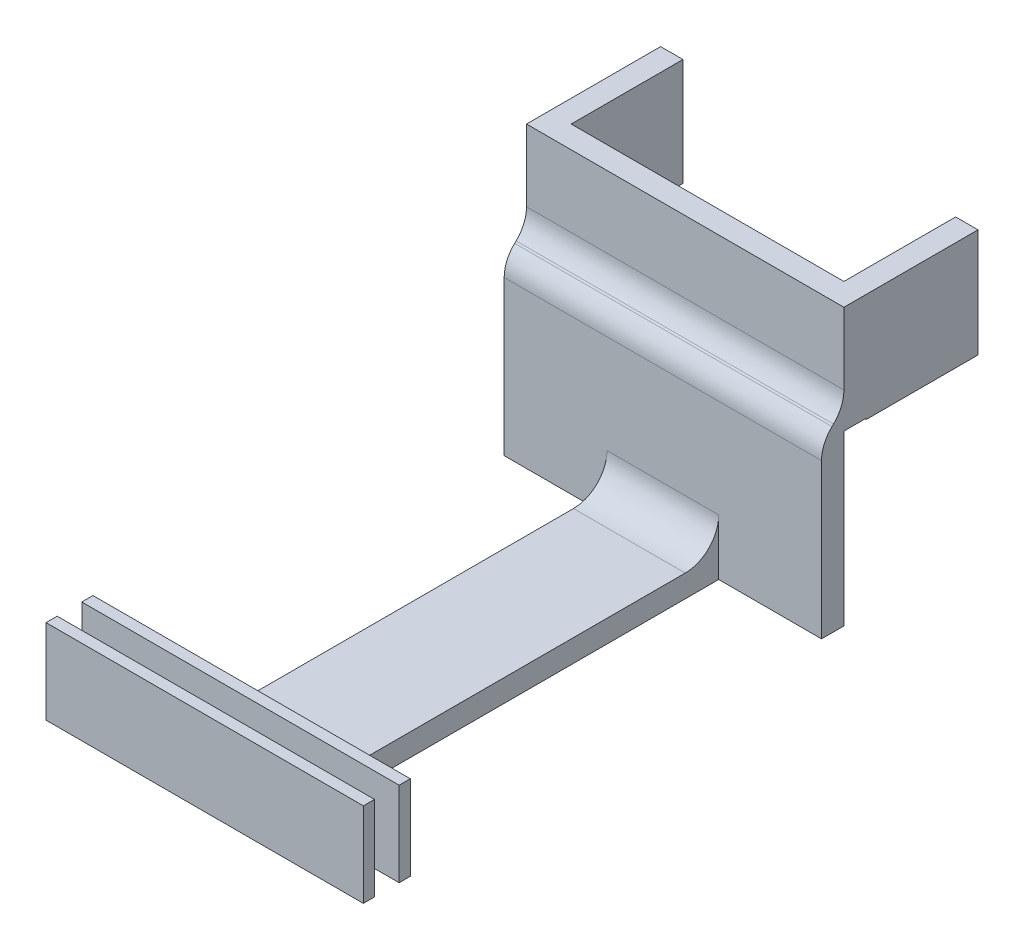
ISO-10303-21;
HEADER;
FILE_DESCRIPTION(('STEP AP214'),'2;1');
FILE_NAME('part.step','',(''),(''),'','','');
FILE_SCHEMA(('AUTOMOTIVE_DESIGN { 1 0 10303 214 1 1 1 1 }'));
ENDSEC;
DATA;
#1=APPLICATION_CONTEXT('core data for automotive mechanical design processes');
#2=APPLICATION_PROTOCOL_DEFINITION('international standard','automotive_design',2000,#1);
#3=PRODUCT_CONTEXT('',#1,'mechanical');
#4=PRODUCT('Part','Part','',(#3));
#5=PRODUCT_RELATED_PRODUCT_CATEGORY('part','',(#4));
#6=PRODUCT_DEFINITION_FORMATION('','',#4);
#7=PRODUCT_DEFINITION_CONTEXT('part definition',#1,'design');
#8=PRODUCT_DEFINITION('design','',#6,#7);
#9=PRODUCT_DEFINITION_SHAPE('','',#8);
#10=(LENGTH_UNIT() NAMED_UNIT(*) SI_UNIT(.MILLI.,.METRE.));
#11=(NAMED_UNIT(*) PLANE_ANGLE_UNIT() SI_UNIT($,.RADIAN.));
#12=(NAMED_UNIT(*) SI_UNIT($,.STERADIAN.) SOLID_ANGLE_UNIT());
#13=UNCERTAINTY_MEASURE_WITH_UNIT(LENGTH_MEASURE(1.E-05),#10,'distance_accuracy_value','');
#14=(GEOMETRIC_REPRESENTATION_CONTEXT(3) GLOBAL_UNCERTAINTY_ASSIGNED_CONTEXT((#13)) GLOBAL_UNIT_ASSIGNED_CONTEXT((#10,
#11,#12)) REPRESENTATION_CONTEXT('',''));
#15=CARTESIAN_POINT('',(0.,0.,0.));
#16=DIRECTION('',(0.,0.,1.));
#17=DIRECTION('',(1.,0.,0.));
#18=AXIS2_PLACEMENT_3D('',#15,#16,#17);
#19=CARTESIAN_POINT('',(0.,0.,-2.));
#20=DIRECTION('',(0.,0.,1.));
#21=DIRECTION('',(1.,0.,0.));
#22=AXIS2_PLACEMENT_3D('',#19,#20,#21);
#23=PLANE('',#22);
#24=DIRECTION('',(0.,1.,0.));
#25=VECTOR('',#24,1.);
#26=CARTESIAN_POINT('',(26.4,24.7,-2.));
#27=LINE('',#26,#25);
#28=CARTESIAN_POINT('',(26.4,15.1,-2.));
#29=VERTEX_POINT('',#28);
#30=CARTESIAN_POINT('',(26.4,24.7,-2.));
#31=VERTEX_POINT('',#30);
#32=EDGE_CURVE('E494',#29,#31,#27,.T.);
#33=ORIENTED_EDGE('',*,*,#32,.F.);
#34=DIRECTION('',(-1.,0.,0.));
#35=VECTOR('',#34,1.);
#36=CARTESIAN_POINT('',(28.4,15.1,-2.));
#37=LINE('',#36,#35);
#38=CARTESIAN_POINT('',(2.,15.1,-2.));
#39=VERTEX_POINT('',#38);
#40=EDGE_CURVE('E545',#29,#39,#37,.T.);
#41=ORIENTED_EDGE('',*,*,#40,.T.);
#42=DIRECTION('',(0.,-1.,0.));
#43=VECTOR('',#42,1.);
#44=CARTESIAN_POINT('',(2.,15.1,-2.));
#45=LINE('',#44,#43);
#46=CARTESIAN_POINT('',(2.,24.7,-2.));
#47=VERTEX_POINT('',#46);
#48=EDGE_CURVE('E500',#47,#39,#45,.T.);
#49=ORIENTED_EDGE('',*,*,#48,.F.);
#50=DIRECTION('',(1.,0.,0.));
#51=VECTOR('',#50,1.);
#52=CARTESIAN_POINT('',(28.4,24.7,-2.));
#53=LINE('',#52,#51);
#54=EDGE_CURVE('E544',#47,#31,#53,.T.);
#55=ORIENTED_EDGE('',*,*,#54,.T.);
#56=EDGE_LOOP('',(#33,#41,#49,#55));
#57=FACE_BOUND('',#56,.T.);
#58=ADVANCED_FACE('F47',(#57),#23,.F.);
#59=CARTESIAN_POINT('',(28.4,15.1,-2.));
#60=DIRECTION('',(-1.,0.,0.));
#61=DIRECTION('',(0.,0.,1.));
#62=AXIS2_PLACEMENT_3D('',#59,#60,#61);
#63=PLANE('',#62);
#64=DIRECTION('',(0.,-0.68874946191469,0.724999433594417));
#65=VECTOR('',#64,1.);
#66=CARTESIAN_POINT('',(28.4,15.1,2.));
#67=LINE('',#66,#65);
#68=CARTESIAN_POINT('',(28.4,16.1129359664569,0.933751614255932));
#69=VERTEX_POINT('',#68);
#70=CARTESIAN_POINT('',(28.4,15.9870640335431,1.06624838574407));
#71=VERTEX_POINT('',#70);
#72=EDGE_CURVE('E470',#69,#71,#67,.T.);
#73=ORIENTED_EDGE('',*,*,#72,.T.);
#74=CARTESIAN_POINT('',(28.4,13.8120657327599,-1.));
#75=DIRECTION('',(-1.,0.,0.));
#76=DIRECTION('',(0.,0.,1.));
#77=AXIS2_PLACEMENT_3D('',#74,#75,#76);
#78=CIRCLE('',#77,3.);
#79=CARTESIAN_POINT('',(28.4,13.8120657327599,2.));
#80=VERTEX_POINT('',#79);
#81=EDGE_CURVE('E598',#71,#80,#78,.F.);
#82=ORIENTED_EDGE('',*,*,#81,.T.);
#83=DIRECTION('',(0.,1.,0.));
#84=VECTOR('',#83,1.);
#85=CARTESIAN_POINT('',(28.4,0.,2.));
#86=LINE('',#85,#84);
#87=CARTESIAN_POINT('',(28.4,0.,2.));
#88=VERTEX_POINT('',#87);
#89=EDGE_CURVE('E445',#88,#80,#86,.T.);
#90=ORIENTED_EDGE('',*,*,#89,.F.);
#91=DIRECTION('',(0.,0.,-1.));
#92=VECTOR('',#91,1.);
#93=CARTESIAN_POINT('',(28.4,0.,2.));
#94=LINE('',#93,#92);
#95=CARTESIAN_POINT('',(28.4,0.,0.));
#96=VERTEX_POINT('',#95);
#97=EDGE_CURVE('E449',#88,#96,#94,.T.);
#98=ORIENTED_EDGE('',*,*,#97,.T.);
#99=DIRECTION('',(0.,1.,0.));
#100=VECTOR('',#99,1.);
#101=CARTESIAN_POINT('',(28.4,0.,0.));
#102=LINE('',#101,#100);
#103=CARTESIAN_POINT('',(28.4,15.1,0.));
#104=VERTEX_POINT('',#103);
#105=EDGE_CURVE('E456',#96,#104,#102,.T.);
#106=ORIENTED_EDGE('',*,*,#105,.T.);
#107=DIRECTION('',(0.,0.,1.));
#108=VECTOR('',#107,1.);
#109=CARTESIAN_POINT('',(28.4,15.1,-2.));
#110=LINE('',#109,#108);
#111=CARTESIAN_POINT('',(28.4,15.1,-2.));
#112=VERTEX_POINT('',#111);
#113=EDGE_CURVE('E568',#112,#104,#110,.T.);
#114=ORIENTED_EDGE('',*,*,#113,.F.);
#115=DIRECTION('',(0.,-1.,0.));
#116=VECTOR('',#115,1.);
#117=CARTESIAN_POINT('',(28.4,24.7,-2.));
#118=LINE('',#117,#116);
#119=CARTESIAN_POINT('',(28.4,15.,-2.));
#120=VERTEX_POINT('',#119);
#121=EDGE_CURVE('E497',#112,#120,#118,.T.);
#122=ORIENTED_EDGE('',*,*,#121,.T.);
#123=DIRECTION('',(0.,0.,1.));
#124=VECTOR('',#123,1.);
#125=CARTESIAN_POINT('',(28.4,15.,-12.));
#126=LINE('',#125,#124);
#127=CARTESIAN_POINT('',(28.4,15.,-12.));
#128=VERTEX_POINT('',#127);
#129=EDGE_CURVE('E473',#128,#120,#126,.T.);
#130=ORIENTED_EDGE('',*,*,#129,.F.);
#131=DIRECTION('',(0.,-1.,0.));
#132=VECTOR('',#131,1.);
#133=CARTESIAN_POINT('',(28.4,24.7,-12.));
#134=LINE('',#133,#132);
#135=CARTESIAN_POINT('',(28.4,24.7,-12.));
#136=VERTEX_POINT('',#135);
#137=EDGE_CURVE('E510',#136,#128,#134,.T.);
#138=ORIENTED_EDGE('',*,*,#137,.F.);
#139=DIRECTION('',(0.,0.,1.));
#140=VECTOR('',#139,1.);
#141=CARTESIAN_POINT('',(28.4,24.7,-2.));
#142=LINE('',#141,#140);
#143=CARTESIAN_POINT('',(28.4,24.7,0.));
#144=VERTEX_POINT('',#143);
#145=EDGE_CURVE('E548',#136,#144,#142,.T.);
#146=ORIENTED_EDGE('',*,*,#145,.T.);
#147=DIRECTION('',(0.,-1.,0.));
#148=VECTOR('',#147,1.);
#149=CARTESIAN_POINT('',(28.4,15.1,0.));
#150=LINE('',#149,#148);
#151=CARTESIAN_POINT('',(28.4,18.2879342672401,0.));
#152=VERTEX_POINT('',#151);
#153=EDGE_CURVE('E539',#144,#152,#150,.T.);
#154=ORIENTED_EDGE('',*,*,#153,.T.);
#155=CARTESIAN_POINT('',(28.4,18.2879342672401,3.));
#156=DIRECTION('',(-1.,0.,0.));
#157=DIRECTION('',(0.,0.,1.));
#158=AXIS2_PLACEMENT_3D('',#155,#156,#157);
#159=CIRCLE('',#158,3.);
#160=EDGE_CURVE('E11',#152,#69,#159,.T.);
#161=ORIENTED_EDGE('',*,*,#160,.T.);
#162=EDGE_LOOP('',(#73,#82,#90,#98,#106,#114,#122,#130,#138,#146,#154,#161));
#163=FACE_BOUND('',#162,.T.);
#164=ADVANCED_FACE('F626',(#163),#63,.F.);
#165=CARTESIAN_POINT('',(28.4,15.1,-2.));
#166=DIRECTION('',(0.,1.,0.));
#167=DIRECTION('',(0.,0.,1.));
#168=AXIS2_PLACEMENT_3D('',#165,#166,#167);
#169=PLANE('',#168);
#170=ORIENTED_EDGE('',*,*,#113,.T.);
#171=DIRECTION('',(-1.,0.,0.));
#172=VECTOR('',#171,1.);
#173=CARTESIAN_POINT('',(0.,15.1,0.));
#174=LINE('',#173,#172);
#175=CARTESIAN_POINT('',(0.,15.1,0.));
#176=VERTEX_POINT('',#175);
#177=EDGE_CURVE('E440',#104,#176,#174,.T.);
#178=ORIENTED_EDGE('',*,*,#177,.T.);
#179=DIRECTION('',(0.,0.,1.));
#180=VECTOR('',#179,1.);
#181=CARTESIAN_POINT('',(0.,15.1,-2.));
#182=LINE('',#181,#180);
#183=CARTESIAN_POINT('',(0.,15.1,-12.));
#184=VERTEX_POINT('',#183);
#185=EDGE_CURVE('E564',#184,#176,#182,.T.);
#186=ORIENTED_EDGE('',*,*,#185,.F.);
#187=DIRECTION('',(-1.,0.,0.));
#188=VECTOR('',#187,1.);
#189=CARTESIAN_POINT('',(0.,15.1,-12.));
#190=LINE('',#189,#188);
#191=CARTESIAN_POINT('',(2.,15.1,-12.));
#192=VERTEX_POINT('',#191);
#193=EDGE_CURVE('E524',#192,#184,#190,.T.);
#194=ORIENTED_EDGE('',*,*,#193,.F.);
#195=DIRECTION('',(0.,0.,1.));
#196=VECTOR('',#195,1.);
#197=CARTESIAN_POINT('',(2.,15.1,-12.));
#198=LINE('',#197,#196);
#199=EDGE_CURVE('E528',#192,#39,#198,.T.);
#200=ORIENTED_EDGE('',*,*,#199,.T.);
#201=ORIENTED_EDGE('',*,*,#40,.F.);
#202=EDGE_CURVE('E540',#112,#29,#37,.T.);
#203=ORIENTED_EDGE('',*,*,#202,.F.);
#204=EDGE_LOOP('',(#170,#178,#186,#194,#200,#201,#203));
#205=FACE_BOUND('',#204,.T.);
#206=ADVANCED_FACE('F645',(#205),#169,.F.);
#207=CARTESIAN_POINT('',(0.,15.1,-2.));
#208=DIRECTION('',(1.,0.,0.));
#209=DIRECTION('',(0.,0.,-1.));
#210=AXIS2_PLACEMENT_3D('',#207,#208,#209);
#211=PLANE('',#210);
#212=DIRECTION('',(0.,-1.,0.));
#213=VECTOR('',#212,1.);
#214=CARTESIAN_POINT('',(0.,0.,2.));
#215=LINE('',#214,#213);
#216=CARTESIAN_POINT('',(0.,13.8120657327599,2.));
#217=VERTEX_POINT('',#216);
#218=CARTESIAN_POINT('',(0.,0.,2.));
#219=VERTEX_POINT('',#218);
#220=EDGE_CURVE('E436',#217,#219,#215,.T.);
#221=ORIENTED_EDGE('',*,*,#220,.F.);
#222=CARTESIAN_POINT('',(0.,13.8120657327599,-1.));
#223=DIRECTION('',(1.,0.,0.));
#224=DIRECTION('',(0.,0.,-1.));
#225=AXIS2_PLACEMENT_3D('',#222,#223,#224);
#226=CIRCLE('',#225,3.);
#227=CARTESIAN_POINT('',(0.,15.9870640335431,1.06624838574407));
#228=VERTEX_POINT('',#227);
#229=EDGE_CURVE('E589',#217,#228,#226,.F.);
#230=ORIENTED_EDGE('',*,*,#229,.T.);
#231=DIRECTION('',(0.,0.68874946191469,-0.724999433594417));
#232=VECTOR('',#231,1.);
#233=CARTESIAN_POINT('',(0.,15.1,2.));
#234=LINE('',#233,#232);
#235=CARTESIAN_POINT('',(0.,16.1129359664569,0.933751614255932));
#236=VERTEX_POINT('',#235);
#237=EDGE_CURVE('E469',#228,#236,#234,.T.);
#238=ORIENTED_EDGE('',*,*,#237,.T.);
#239=CARTESIAN_POINT('',(0.,18.2879342672401,3.));
#240=DIRECTION('',(1.,0.,0.));
#241=DIRECTION('',(0.,0.,-1.));
#242=AXIS2_PLACEMENT_3D('',#239,#240,#241);
#243=CIRCLE('',#242,3.);
#244=CARTESIAN_POINT('',(0.,18.2879342672401,0.));
#245=VERTEX_POINT('',#244);
#246=EDGE_CURVE('E56',#236,#245,#243,.T.);
#247=ORIENTED_EDGE('',*,*,#246,.T.);
#248=DIRECTION('',(0.,1.,0.));
#249=VECTOR('',#248,1.);
#250=CARTESIAN_POINT('',(0.,15.1,0.));
#251=LINE('',#250,#249);
#252=CARTESIAN_POINT('',(0.,24.7,0.));
#253=VERTEX_POINT('',#252);
#254=EDGE_CURVE('E551',#245,#253,#251,.T.);
#255=ORIENTED_EDGE('',*,*,#254,.T.);
#256=DIRECTION('',(0.,0.,1.));
#257=VECTOR('',#256,1.);
#258=CARTESIAN_POINT('',(0.,24.7,-2.));
#259=LINE('',#258,#257);
#260=CARTESIAN_POINT('',(0.,24.7,-12.));
#261=VERTEX_POINT('',#260);
#262=EDGE_CURVE('E560',#261,#253,#259,.T.);
#263=ORIENTED_EDGE('',*,*,#262,.F.);
#264=DIRECTION('',(0.,1.,0.));
#265=VECTOR('',#264,1.);
#266=CARTESIAN_POINT('',(0.,15.1,-12.));
#267=LINE('',#266,#265);
#268=EDGE_CURVE('E514',#184,#261,#267,.T.);
#269=ORIENTED_EDGE('',*,*,#268,.F.);
#270=ORIENTED_EDGE('',*,*,#185,.T.);
#271=DIRECTION('',(0.,-1.,0.));
#272=VECTOR('',#271,1.);
#273=CARTESIAN_POINT('',(0.,0.,0.));
#274=LINE('',#273,#272);
#275=CARTESIAN_POINT('',(0.,0.,0.));
#276=VERTEX_POINT('',#275);
#277=EDGE_CURVE('E432',#176,#276,#274,.T.);
#278=ORIENTED_EDGE('',*,*,#277,.T.);
#279=DIRECTION('',(0.,0.,-1.));
#280=VECTOR('',#279,1.);
#281=CARTESIAN_POINT('',(0.,0.,2.));
#282=LINE('',#281,#280);
#283=EDGE_CURVE('E465',#219,#276,#282,.T.);
#284=ORIENTED_EDGE('',*,*,#283,.F.);
#285=EDGE_LOOP('',(#221,#230,#238,#247,#255,#263,#269,#270,#278,#284));
#286=FACE_BOUND('',#285,.T.);
#287=ADVANCED_FACE('F619',(#286),#211,.F.);
#288=CARTESIAN_POINT('',(28.4,24.7,-2.));
#289=DIRECTION('',(0.,-1.,0.));
#290=DIRECTION('',(0.,0.,-1.));
#291=AXIS2_PLACEMENT_3D('',#288,#289,#290);
#292=PLANE('',#291);
#293=DIRECTION('',(1.,0.,0.));
#294=VECTOR('',#293,1.);
#295=CARTESIAN_POINT('',(28.4,24.7,0.));
#296=LINE('',#295,#294);
#297=EDGE_CURVE('E554',#253,#144,#296,.T.);
#298=ORIENTED_EDGE('',*,*,#297,.T.);
#299=ORIENTED_EDGE('',*,*,#145,.F.);
#300=DIRECTION('',(1.,0.,0.));
#301=VECTOR('',#300,1.);
#302=CARTESIAN_POINT('',(26.4,24.7,-12.));
#303=LINE('',#302,#301);
#304=CARTESIAN_POINT('',(26.4,24.7,-12.));
#305=VERTEX_POINT('',#304);
#306=EDGE_CURVE('E488',#305,#136,#303,.T.);
#307=ORIENTED_EDGE('',*,*,#306,.F.);
#308=DIRECTION('',(0.,0.,1.));
#309=VECTOR('',#308,1.);
#310=CARTESIAN_POINT('',(26.4,24.7,-12.));
#311=LINE('',#310,#309);
#312=EDGE_CURVE('E484',#305,#31,#311,.T.);
#313=ORIENTED_EDGE('',*,*,#312,.T.);
#314=ORIENTED_EDGE('',*,*,#54,.F.);
#315=DIRECTION('',(0.,0.,1.));
#316=VECTOR('',#315,1.);
#317=CARTESIAN_POINT('',(2.,24.7,-12.));
#318=LINE('',#317,#316);
#319=CARTESIAN_POINT('',(2.,24.7,-12.));
#320=VERTEX_POINT('',#319);
#321=EDGE_CURVE('E535',#320,#47,#318,.T.);
#322=ORIENTED_EDGE('',*,*,#321,.F.);
#323=DIRECTION('',(1.,0.,0.));
#324=VECTOR('',#323,1.);
#325=CARTESIAN_POINT('',(0.,24.7,-12.));
#326=LINE('',#325,#324);
#327=EDGE_CURVE('E518',#261,#320,#326,.T.);
#328=ORIENTED_EDGE('',*,*,#327,.F.);
#329=ORIENTED_EDGE('',*,*,#262,.T.);
#330=EDGE_LOOP('',(#298,#299,#307,#313,#314,#322,#328,#329));
#331=FACE_BOUND('',#330,.T.);
#332=ADVANCED_FACE('F662',(#331),#292,.F.);
#333=CARTESIAN_POINT('',(0.,0.,0.));
#334=DIRECTION('',(0.,0.,1.));
#335=DIRECTION('',(1.,0.,0.));
#336=AXIS2_PLACEMENT_3D('',#333,#334,#335);
#337=PLANE('',#336);
#338=ORIENTED_EDGE('',*,*,#254,.F.);
#339=DIRECTION('',(-1.,0.,0.));
#340=VECTOR('',#339,1.);
#341=CARTESIAN_POINT('',(28.4,18.2879342672401,0.));
#342=LINE('',#341,#340);
#343=EDGE_CURVE('E63',#245,#152,#342,.F.);
#344=ORIENTED_EDGE('',*,*,#343,.T.);
#345=ORIENTED_EDGE('',*,*,#153,.F.);
#346=ORIENTED_EDGE('',*,*,#297,.F.);
#347=EDGE_LOOP('',(#338,#344,#345,#346));
#348=FACE_BOUND('',#347,.T.);
#349=ADVANCED_FACE('F623',(#348),#337,.T.);
#350=CARTESIAN_POINT('',(2.,15.1,-12.));
#351=DIRECTION('',(-1.,0.,0.));
#352=DIRECTION('',(0.,0.,1.));
#353=AXIS2_PLACEMENT_3D('',#350,#351,#352);
#354=PLANE('',#353);
#355=ORIENTED_EDGE('',*,*,#48,.T.);
#356=ORIENTED_EDGE('',*,*,#199,.F.);
#357=DIRECTION('',(0.,-1.,0.));
#358=VECTOR('',#357,1.);
#359=CARTESIAN_POINT('',(2.,15.1,-12.));
#360=LINE('',#359,#358);
#361=EDGE_CURVE('E521',#320,#192,#360,.T.);
#362=ORIENTED_EDGE('',*,*,#361,.F.);
#363=ORIENTED_EDGE('',*,*,#321,.T.);
#364=EDGE_LOOP('',(#355,#356,#362,#363));
#365=FACE_BOUND('',#364,.T.);
#366=ADVANCED_FACE('F657',(#365),#354,.F.);
#367=CARTESIAN_POINT('',(0.,0.,-12.));
#368=DIRECTION('',(0.,0.,-1.));
#369=DIRECTION('',(-1.,0.,0.));
#370=AXIS2_PLACEMENT_3D('',#367,#368,#369);
#371=PLANE('',#370);
#372=ORIENTED_EDGE('',*,*,#268,.T.);
#373=ORIENTED_EDGE('',*,*,#327,.T.);
#374=ORIENTED_EDGE('',*,*,#361,.T.);
#375=ORIENTED_EDGE('',*,*,#193,.T.);
#376=EDGE_LOOP('',(#372,#373,#374,#375));
#377=FACE_BOUND('',#376,.T.);
#378=ADVANCED_FACE('F651',(#377),#371,.T.);
#379=CARTESIAN_POINT('',(0.,0.,-2.));
#380=DIRECTION('',(0.,0.,1.));
#381=DIRECTION('',(1.,0.,0.));
#382=AXIS2_PLACEMENT_3D('',#379,#380,#381);
#383=PLANE('',#382);
#384=ORIENTED_EDGE('',*,*,#202,.T.);
#385=CARTESIAN_POINT('',(26.4,15.,-2.));
#386=VERTEX_POINT('',#385);
#387=EDGE_CURVE('E489',#386,#29,#27,.T.);
#388=ORIENTED_EDGE('',*,*,#387,.F.);
#389=DIRECTION('',(-1.,0.,0.));
#390=VECTOR('',#389,1.);
#391=CARTESIAN_POINT('',(26.4,15.,-2.));
#392=LINE('',#391,#390);
#393=EDGE_CURVE('E493',#120,#386,#392,.T.);
#394=ORIENTED_EDGE('',*,*,#393,.F.);
#395=ORIENTED_EDGE('',*,*,#121,.F.);
#396=EDGE_LOOP('',(#384,#388,#394,#395));
#397=FACE_BOUND('',#396,.T.);
#398=ADVANCED_FACE('F950',(#397),#383,.T.);
#399=CARTESIAN_POINT('',(26.4,15.,-12.));
#400=DIRECTION('',(0.,1.,0.));
#401=DIRECTION('',(0.,0.,1.));
#402=AXIS2_PLACEMENT_3D('',#399,#400,#401);
#403=PLANE('',#402);
#404=ORIENTED_EDGE('',*,*,#393,.T.);
#405=DIRECTION('',(0.,0.,1.));
#406=VECTOR('',#405,1.);
#407=CARTESIAN_POINT('',(26.4,15.,-12.));
#408=LINE('',#407,#406);
#409=CARTESIAN_POINT('',(26.4,15.,-12.));
#410=VERTEX_POINT('',#409);
#411=EDGE_CURVE('E480',#410,#386,#408,.T.);
#412=ORIENTED_EDGE('',*,*,#411,.F.);
#413=DIRECTION('',(-1.,0.,0.));
#414=VECTOR('',#413,1.);
#415=CARTESIAN_POINT('',(26.4,15.,-12.));
#416=LINE('',#415,#414);
#417=EDGE_CURVE('E507',#128,#410,#416,.T.);
#418=ORIENTED_EDGE('',*,*,#417,.F.);
#419=ORIENTED_EDGE('',*,*,#129,.T.);
#420=EDGE_LOOP('',(#404,#412,#418,#419));
#421=FACE_BOUND('',#420,.T.);
#422=ADVANCED_FACE('F942',(#421),#403,.F.);
#423=CARTESIAN_POINT('',(26.4,24.7,-12.));
#424=DIRECTION('',(1.,0.,0.));
#425=DIRECTION('',(0.,0.,-1.));
#426=AXIS2_PLACEMENT_3D('',#423,#424,#425);
#427=PLANE('',#426);
#428=ORIENTED_EDGE('',*,*,#387,.T.);
#429=ORIENTED_EDGE('',*,*,#32,.T.);
#430=ORIENTED_EDGE('',*,*,#312,.F.);
#431=DIRECTION('',(0.,1.,0.));
#432=VECTOR('',#431,1.);
#433=CARTESIAN_POINT('',(26.4,24.7,-12.));
#434=LINE('',#433,#432);
#435=EDGE_CURVE('E504',#410,#305,#434,.T.);
#436=ORIENTED_EDGE('',*,*,#435,.F.);
#437=ORIENTED_EDGE('',*,*,#411,.T.);
#438=EDGE_LOOP('',(#428,#429,#430,#436,#437));
#439=FACE_BOUND('',#438,.T.);
#440=ADVANCED_FACE('F667',(#439),#427,.F.);
#441=CARTESIAN_POINT('',(0.,0.,-12.));
#442=DIRECTION('',(0.,0.,1.));
#443=DIRECTION('',(1.,0.,0.));
#444=AXIS2_PLACEMENT_3D('',#441,#442,#443);
#445=PLANE('',#444);
#446=ORIENTED_EDGE('',*,*,#137,.T.);
#447=ORIENTED_EDGE('',*,*,#417,.T.);
#448=ORIENTED_EDGE('',*,*,#435,.T.);
#449=ORIENTED_EDGE('',*,*,#306,.T.);
#450=EDGE_LOOP('',(#446,#447,#448,#449));
#451=FACE_BOUND('',#450,.T.);
#452=ADVANCED_FACE('F771',(#451),#445,.F.);
#453=CARTESIAN_POINT('',(31.1586228448267,15.1,2.));
#454=DIRECTION('',(0.,0.724999433594417,0.68874946191469));
#455=DIRECTION('',(0.,-0.68874946191469,0.724999433594417));
#456=AXIS2_PLACEMENT_3D('',#453,#454,#455);
#457=PLANE('',#456);
#458=ORIENTED_EDGE('',*,*,#237,.F.);
#459=DIRECTION('',(-1.,0.,0.));
#460=VECTOR('',#459,1.);
#461=CARTESIAN_POINT('',(28.4,15.9870640335431,1.06624838574407));
#462=LINE('',#461,#460);
#463=EDGE_CURVE('E71',#228,#71,#462,.F.);
#464=ORIENTED_EDGE('',*,*,#463,.T.);
#465=ORIENTED_EDGE('',*,*,#72,.F.);
#466=DIRECTION('',(-1.,0.,0.));
#467=VECTOR('',#466,1.);
#468=CARTESIAN_POINT('',(0.,16.1129359664569,0.933751614255932));
#469=LINE('',#468,#467);
#470=EDGE_CURVE('E592',#69,#236,#469,.T.);
#471=ORIENTED_EDGE('',*,*,#470,.T.);
#472=EDGE_LOOP('',(#458,#464,#465,#471));
#473=FACE_BOUND('',#472,.T.);
#474=ADVANCED_FACE('F628',(#473),#457,.T.);
#475=CARTESIAN_POINT('',(19.2,2.,2.));
#476=DIRECTION('',(1.,0.,0.));
#477=DIRECTION('',(0.,0.,-1.));
#478=AXIS2_PLACEMENT_3D('',#475,#476,#477);
#479=PLANE('',#478);
#480=DIRECTION('',(0.,-1.,0.));
#481=VECTOR('',#480,1.);
#482=CARTESIAN_POINT('',(19.2,2.,2.));
#483=LINE('',#482,#481);
#484=CARTESIAN_POINT('',(19.2,5.,2.));
#485=VERTEX_POINT('',#484);
#486=CARTESIAN_POINT('',(19.2,0.,2.));
#487=VERTEX_POINT('',#486);
#488=EDGE_CURVE('E428',#485,#487,#483,.T.);
#489=ORIENTED_EDGE('',*,*,#488,.F.);
#490=CARTESIAN_POINT('',(19.2,5.,5.));
#491=DIRECTION('',(1.,0.,0.));
#492=DIRECTION('',(0.,0.,-1.));
#493=AXIS2_PLACEMENT_3D('',#490,#491,#492);
#494=CIRCLE('',#493,3.);
#495=CARTESIAN_POINT('',(19.2,2.,5.));
#496=VERTEX_POINT('',#495);
#497=EDGE_CURVE('E610',#485,#496,#494,.F.);
#498=ORIENTED_EDGE('',*,*,#497,.T.);
#499=DIRECTION('',(0.,0.,1.));
#500=VECTOR('',#499,1.);
#501=CARTESIAN_POINT('',(19.2,2.,2.));
#502=LINE('',#501,#500);
#503=CARTESIAN_POINT('',(19.2,2.,35.8));
#504=VERTEX_POINT('',#503);
#505=EDGE_CURVE('E413',#496,#504,#502,.T.);
#506=ORIENTED_EDGE('',*,*,#505,.T.);
#507=CARTESIAN_POINT('',(19.2,5.,35.8));
#508=DIRECTION('',(1.,0.,0.));
#509=DIRECTION('',(0.,0.,-1.));
#510=AXIS2_PLACEMENT_3D('',#507,#508,#509);
#511=CIRCLE('',#510,3.);
#512=CARTESIAN_POINT('',(19.2,5.,38.8));
#513=VERTEX_POINT('',#512);
#514=EDGE_CURVE('E606',#504,#513,#511,.F.);
#515=ORIENTED_EDGE('',*,*,#514,.T.);
#516=DIRECTION('',(0.,-1.,0.));
#517=VECTOR('',#516,1.);
#518=CARTESIAN_POINT('',(19.2,2.,38.8));
#519=LINE('',#518,#517);
#520=CARTESIAN_POINT('',(19.2,0.,38.8));
#521=VERTEX_POINT('',#520);
#522=EDGE_CURVE('E345',#513,#521,#519,.T.);
#523=ORIENTED_EDGE('',*,*,#522,.T.);
#524=DIRECTION('',(0.,0.,1.));
#525=VECTOR('',#524,1.);
#526=CARTESIAN_POINT('',(19.2,0.,2.));
#527=LINE('',#526,#525);
#528=EDGE_CURVE('E410',#487,#521,#527,.T.);
#529=ORIENTED_EDGE('',*,*,#528,.F.);
#530=EDGE_LOOP('',(#489,#498,#506,#515,#523,#529));
#531=FACE_BOUND('',#530,.T.);
#532=ADVANCED_FACE('F770',(#531),#479,.T.);
#533=CARTESIAN_POINT('',(9.2,2.,2.));
#534=DIRECTION('',(-1.,0.,0.));
#535=DIRECTION('',(0.,0.,1.));
#536=AXIS2_PLACEMENT_3D('',#533,#534,#535);
#537=PLANE('',#536);
#538=DIRECTION('',(0.,0.,-1.));
#539=VECTOR('',#538,1.);
#540=CARTESIAN_POINT('',(9.2,0.,2.));
#541=LINE('',#540,#539);
#542=CARTESIAN_POINT('',(9.2,0.,38.8));
#543=VERTEX_POINT('',#542);
#544=CARTESIAN_POINT('',(9.2,0.,2.));
#545=VERTEX_POINT('',#544);
#546=EDGE_CURVE('E418',#543,#545,#541,.T.);
#547=ORIENTED_EDGE('',*,*,#546,.F.);
#548=DIRECTION('',(0.,1.,0.));
#549=VECTOR('',#548,1.);
#550=CARTESIAN_POINT('',(9.2,2.,38.8));
#551=LINE('',#550,#549);
#552=CARTESIAN_POINT('',(9.2,5.,38.8));
#553=VERTEX_POINT('',#552);
#554=EDGE_CURVE('E342',#543,#553,#551,.T.);
#555=ORIENTED_EDGE('',*,*,#554,.T.);
#556=CARTESIAN_POINT('',(9.2,5.,35.8));
#557=DIRECTION('',(-1.,0.,0.));
#558=DIRECTION('',(0.,0.,1.));
#559=AXIS2_PLACEMENT_3D('',#556,#557,#558);
#560=CIRCLE('',#559,3.);
#561=CARTESIAN_POINT('',(9.2,2.,35.8));
#562=VERTEX_POINT('',#561);
#563=EDGE_CURVE('E603',#553,#562,#560,.F.);
#564=ORIENTED_EDGE('',*,*,#563,.T.);
#565=DIRECTION('',(0.,0.,-1.));
#566=VECTOR('',#565,1.);
#567=CARTESIAN_POINT('',(9.2,2.,2.));
#568=LINE('',#567,#566);
#569=CARTESIAN_POINT('',(9.2,2.,5.));
#570=VERTEX_POINT('',#569);
#571=EDGE_CURVE('E417',#562,#570,#568,.T.);
#572=ORIENTED_EDGE('',*,*,#571,.T.);
#573=CARTESIAN_POINT('',(9.2,5.,5.));
#574=DIRECTION('',(-1.,0.,0.));
#575=DIRECTION('',(0.,0.,1.));
#576=AXIS2_PLACEMENT_3D('',#573,#574,#575);
#577=CIRCLE('',#576,3.);
#578=CARTESIAN_POINT('',(9.2,5.,2.));
#579=VERTEX_POINT('',#578);
#580=EDGE_CURVE('E613',#570,#579,#577,.F.);
#581=ORIENTED_EDGE('',*,*,#580,.T.);
#582=DIRECTION('',(0.,-1.,0.));
#583=VECTOR('',#582,1.);
#584=CARTESIAN_POINT('',(9.2,2.,2.));
#585=LINE('',#584,#583);
#586=EDGE_CURVE('E422',#579,#545,#585,.T.);
#587=ORIENTED_EDGE('',*,*,#586,.T.);
#588=EDGE_LOOP('',(#547,#555,#564,#572,#581,#587));
#589=FACE_BOUND('',#588,.T.);
#590=ADVANCED_FACE('F911',(#589),#537,.T.);
#591=CARTESIAN_POINT('',(0.,2.,0.));
#592=DIRECTION('',(0.,-1.,0.));
#593=DIRECTION('',(0.,0.,-1.));
#594=AXIS2_PLACEMENT_3D('',#591,#592,#593);
#595=PLANE('',#594);
#596=ORIENTED_EDGE('',*,*,#571,.F.);
#597=DIRECTION('',(-1.,0.,0.));
#598=VECTOR('',#597,1.);
#599=CARTESIAN_POINT('',(19.2,2.,35.8));
#600=LINE('',#599,#598);
#601=EDGE_CURVE('E578',#562,#504,#600,.F.);
#602=ORIENTED_EDGE('',*,*,#601,.T.);
#603=ORIENTED_EDGE('',*,*,#505,.F.);
#604=DIRECTION('',(1.,0.,0.));
#605=VECTOR('',#604,1.);
#606=CARTESIAN_POINT('',(9.2,2.,5.));
#607=LINE('',#606,#605);
#608=EDGE_CURVE('E575',#496,#570,#607,.F.);
#609=ORIENTED_EDGE('',*,*,#608,.T.);
#610=EDGE_LOOP('',(#596,#602,#603,#609));
#611=FACE_BOUND('',#610,.T.);
#612=ADVANCED_FACE('F903',(#611),#595,.F.);
#613=CARTESIAN_POINT('',(0.,0.,2.));
#614=DIRECTION('',(0.,0.,-1.));
#615=DIRECTION('',(-1.,0.,0.));
#616=AXIS2_PLACEMENT_3D('',#613,#614,#615);
#617=PLANE('',#616);
#618=DIRECTION('',(1.,0.,0.));
#619=VECTOR('',#618,1.);
#620=CARTESIAN_POINT('',(19.2,5.,2.));
#621=LINE('',#620,#619);
#622=EDGE_CURVE('E585',#579,#485,#621,.T.);
#623=ORIENTED_EDGE('',*,*,#622,.T.);
#624=ORIENTED_EDGE('',*,*,#488,.T.);
#625=DIRECTION('',(1.,0.,0.));
#626=VECTOR('',#625,1.);
#627=CARTESIAN_POINT('',(0.,0.,2.));
#628=LINE('',#627,#626);
#629=EDGE_CURVE('E439',#487,#88,#628,.T.);
#630=ORIENTED_EDGE('',*,*,#629,.T.);
#631=ORIENTED_EDGE('',*,*,#89,.T.);
#632=DIRECTION('',(-1.,0.,0.));
#633=VECTOR('',#632,1.);
#634=CARTESIAN_POINT('',(0.,13.8120657327599,2.));
#635=LINE('',#634,#633);
#636=EDGE_CURVE('E581',#80,#217,#635,.T.);
#637=ORIENTED_EDGE('',*,*,#636,.T.);
#638=ORIENTED_EDGE('',*,*,#220,.T.);
#639=EDGE_CURVE('E441',#219,#545,#628,.T.);
#640=ORIENTED_EDGE('',*,*,#639,.T.);
#641=ORIENTED_EDGE('',*,*,#586,.F.);
#642=EDGE_LOOP('',(#623,#624,#630,#631,#637,#638,#640,#641));
#643=FACE_BOUND('',#642,.T.);
#644=ADVANCED_FACE('F634',(#643),#617,.F.);
#645=CARTESIAN_POINT('',(0.,0.,2.));
#646=DIRECTION('',(0.,1.,0.));
#647=DIRECTION('',(0.,0.,1.));
#648=AXIS2_PLACEMENT_3D('',#645,#646,#647);
#649=PLANE('',#648);
#650=DIRECTION('',(0.,0.,1.));
#651=VECTOR('',#650,1.);
#652=CARTESIAN_POINT('',(16.55,0.,39.8));
#653=LINE('',#652,#651);
#654=CARTESIAN_POINT('',(16.55,0.,39.8));
#655=VERTEX_POINT('',#654);
#656=CARTESIAN_POINT('',(16.55,0.,42.));
#657=VERTEX_POINT('',#656);
#658=EDGE_CURVE('E273',#655,#657,#653,.T.);
#659=ORIENTED_EDGE('',*,*,#658,.T.);
#660=DIRECTION('',(1.,0.,0.));
#661=VECTOR('',#660,1.);
#662=CARTESIAN_POINT('',(0.,0.,42.));
#663=LINE('',#662,#661);
#664=CARTESIAN_POINT('',(28.4,0.,42.));
#665=VERTEX_POINT('',#664);
#666=EDGE_CURVE('E368',#657,#665,#663,.T.);
#667=ORIENTED_EDGE('',*,*,#666,.T.);
#668=DIRECTION('',(0.,0.,-1.));
#669=VECTOR('',#668,1.);
#670=CARTESIAN_POINT('',(28.4,0.,43.));
#671=LINE('',#670,#669);
#672=CARTESIAN_POINT('',(28.4,0.,43.));
#673=VERTEX_POINT('',#672);
#674=EDGE_CURVE('E384',#673,#665,#671,.T.);
#675=ORIENTED_EDGE('',*,*,#674,.F.);
#676=DIRECTION('',(1.,0.,0.));
#677=VECTOR('',#676,1.);
#678=CARTESIAN_POINT('',(0.,0.,43.));
#679=LINE('',#678,#677);
#680=CARTESIAN_POINT('',(0.,0.,43.));
#681=VERTEX_POINT('',#680);
#682=EDGE_CURVE('E354',#681,#673,#679,.T.);
#683=ORIENTED_EDGE('',*,*,#682,.F.);
#684=DIRECTION('',(0.,0.,-1.));
#685=VECTOR('',#684,1.);
#686=CARTESIAN_POINT('',(0.,0.,43.));
#687=LINE('',#686,#685);
#688=CARTESIAN_POINT('',(0.,0.,42.));
#689=VERTEX_POINT('',#688);
#690=EDGE_CURVE('E388',#681,#689,#687,.T.);
#691=ORIENTED_EDGE('',*,*,#690,.T.);
#692=CARTESIAN_POINT('',(11.85,0.,42.));
#693=VERTEX_POINT('',#692);
#694=EDGE_CURVE('E369',#689,#693,#663,.T.);
#695=ORIENTED_EDGE('',*,*,#694,.T.);
#696=DIRECTION('',(0.,0.,-1.));
#697=VECTOR('',#696,1.);
#698=CARTESIAN_POINT('',(11.85,0.,42.));
#699=LINE('',#698,#697);
#700=CARTESIAN_POINT('',(11.85,0.,39.8));
#701=VERTEX_POINT('',#700);
#702=EDGE_CURVE('E298',#693,#701,#699,.T.);
#703=ORIENTED_EDGE('',*,*,#702,.T.);
#704=DIRECTION('',(1.,0.,0.));
#705=VECTOR('',#704,1.);
#706=CARTESIAN_POINT('',(0.,0.,39.8));
#707=LINE('',#706,#705);
#708=CARTESIAN_POINT('',(0.,0.,39.8));
#709=VERTEX_POINT('',#708);
#710=EDGE_CURVE('E279',#709,#701,#707,.T.);
#711=ORIENTED_EDGE('',*,*,#710,.F.);
#712=DIRECTION('',(0.,0.,-1.));
#713=VECTOR('',#712,1.);
#714=CARTESIAN_POINT('',(0.,0.,39.8));
#715=LINE('',#714,#713);
#716=CARTESIAN_POINT('',(0.,0.,38.8));
#717=VERTEX_POINT('',#716);
#718=EDGE_CURVE('E338',#709,#717,#715,.T.);
#719=ORIENTED_EDGE('',*,*,#718,.T.);
#720=DIRECTION('',(1.,0.,0.));
#721=VECTOR('',#720,1.);
#722=CARTESIAN_POINT('',(0.,0.,38.8));
#723=LINE('',#722,#721);
#724=EDGE_CURVE('E320',#717,#543,#723,.T.);
#725=ORIENTED_EDGE('',*,*,#724,.T.);
#726=ORIENTED_EDGE('',*,*,#546,.T.);
#727=ORIENTED_EDGE('',*,*,#639,.F.);
#728=ORIENTED_EDGE('',*,*,#283,.T.);
#729=DIRECTION('',(1.,0.,0.));
#730=VECTOR('',#729,1.);
#731=CARTESIAN_POINT('',(0.,0.,0.));
#732=LINE('',#731,#730);
#733=EDGE_CURVE('E453',#276,#96,#732,.T.);
#734=ORIENTED_EDGE('',*,*,#733,.T.);
#735=ORIENTED_EDGE('',*,*,#97,.F.);
#736=ORIENTED_EDGE('',*,*,#629,.F.);
#737=ORIENTED_EDGE('',*,*,#528,.T.);
#738=CARTESIAN_POINT('',(28.4,0.,38.8));
#739=VERTEX_POINT('',#738);
#740=EDGE_CURVE('E303',#521,#739,#723,.T.);
#741=ORIENTED_EDGE('',*,*,#740,.T.);
#742=DIRECTION('',(0.,0.,-1.));
#743=VECTOR('',#742,1.);
#744=CARTESIAN_POINT('',(28.4,0.,39.8));
#745=LINE('',#744,#743);
#746=CARTESIAN_POINT('',(28.4,0.,39.8));
#747=VERTEX_POINT('',#746);
#748=EDGE_CURVE('E275',#747,#739,#745,.T.);
#749=ORIENTED_EDGE('',*,*,#748,.F.);
#750=EDGE_CURVE('E269',#655,#747,#707,.T.);
#751=ORIENTED_EDGE('',*,*,#750,.F.);
#752=EDGE_LOOP('',(#659,#667,#675,#683,#691,#695,#703,#711,#719,#725,#726,#727,#728,#734,#735,
#736,#737,#741,#749,#751));
#753=FACE_BOUND('',#752,.T.);
#754=ADVANCED_FACE('F271',(#753),#649,.F.);
#755=CARTESIAN_POINT('',(0.,0.,0.));
#756=DIRECTION('',(0.,0.,-1.));
#757=DIRECTION('',(-1.,0.,0.));
#758=AXIS2_PLACEMENT_3D('',#755,#756,#757);
#759=PLANE('',#758);
#760=ORIENTED_EDGE('',*,*,#277,.F.);
#761=ORIENTED_EDGE('',*,*,#177,.F.);
#762=ORIENTED_EDGE('',*,*,#105,.F.);
#763=ORIENTED_EDGE('',*,*,#733,.F.);
#764=EDGE_LOOP('',(#760,#761,#762,#763));
#765=FACE_BOUND('',#764,.T.);
#766=ADVANCED_FACE('F643',(#765),#759,.T.);
#767=CARTESIAN_POINT('',(16.55,0.,39.8));
#768=DIRECTION('',(1.,0.,0.));
#769=DIRECTION('',(0.,0.,-1.));
#770=AXIS2_PLACEMENT_3D('',#767,#768,#769);
#771=PLANE('',#770);
#772=DIRECTION('',(0.,1.,0.));
#773=VECTOR('',#772,1.);
#774=CARTESIAN_POINT('',(16.55,0.,42.));
#775=LINE('',#774,#773);
#776=CARTESIAN_POINT('',(16.55,2.5,42.));
#777=VERTEX_POINT('',#776);
#778=EDGE_CURVE('E295',#657,#777,#775,.T.);
#779=ORIENTED_EDGE('',*,*,#778,.F.);
#780=ORIENTED_EDGE('',*,*,#658,.F.);
#781=DIRECTION('',(0.,1.,0.));
#782=VECTOR('',#781,1.);
#783=CARTESIAN_POINT('',(16.55,0.,39.8));
#784=LINE('',#783,#782);
#785=CARTESIAN_POINT('',(16.55,2.5,39.8));
#786=VERTEX_POINT('',#785);
#787=EDGE_CURVE('E283',#655,#786,#784,.T.);
#788=ORIENTED_EDGE('',*,*,#787,.T.);
#789=DIRECTION('',(0.,0.,1.));
#790=VECTOR('',#789,1.);
#791=CARTESIAN_POINT('',(16.55,2.5,39.8));
#792=LINE('',#791,#790);
#793=EDGE_CURVE('E397',#786,#777,#792,.T.);
#794=ORIENTED_EDGE('',*,*,#793,.T.);
#795=EDGE_LOOP('',(#779,#780,#788,#794));
#796=FACE_BOUND('',#795,.T.);
#797=ADVANCED_FACE('F293',(#796),#771,.T.);
#798=CARTESIAN_POINT('',(11.85,0.,39.8));
#799=DIRECTION('',(1.,0.,0.));
#800=DIRECTION('',(0.,0.,-1.));
#801=AXIS2_PLACEMENT_3D('',#798,#799,#800);
#802=PLANE('',#801);
#803=DIRECTION('',(0.,1.,0.));
#804=VECTOR('',#803,1.);
#805=CARTESIAN_POINT('',(11.85,0.,42.));
#806=LINE('',#805,#804);
#807=CARTESIAN_POINT('',(11.85,2.5,42.));
#808=VERTEX_POINT('',#807);
#809=EDGE_CURVE('E290',#693,#808,#806,.T.);
#810=ORIENTED_EDGE('',*,*,#809,.T.);
#811=DIRECTION('',(0.,0.,1.));
#812=VECTOR('',#811,1.);
#813=CARTESIAN_POINT('',(11.85,2.5,39.8));
#814=LINE('',#813,#812);
#815=CARTESIAN_POINT('',(11.85,2.5,39.8));
#816=VERTEX_POINT('',#815);
#817=EDGE_CURVE('E407',#816,#808,#814,.T.);
#818=ORIENTED_EDGE('',*,*,#817,.F.);
#819=DIRECTION('',(0.,1.,0.));
#820=VECTOR('',#819,1.);
#821=CARTESIAN_POINT('',(11.85,0.,39.8));
#822=LINE('',#821,#820);
#823=EDGE_CURVE('E394',#701,#816,#822,.T.);
#824=ORIENTED_EDGE('',*,*,#823,.F.);
#825=ORIENTED_EDGE('',*,*,#702,.F.);
#826=EDGE_LOOP('',(#810,#818,#824,#825));
#827=FACE_BOUND('',#826,.T.);
#828=ADVANCED_FACE('F692',(#827),#802,.F.);
#829=CARTESIAN_POINT('',(14.2,2.5,39.8));
#830=DIRECTION('',(0.,0.,1.));
#831=DIRECTION('',(1.,0.,0.));
#832=AXIS2_PLACEMENT_3D('',#829,#830,#831);
#833=CYLINDRICAL_SURFACE('',#832,2.35);
#834=CARTESIAN_POINT('',(14.2,2.5,42.));
#835=DIRECTION('',(0.,0.,1.));
#836=DIRECTION('',(1.,0.,0.));
#837=AXIS2_PLACEMENT_3D('',#834,#835,#836);
#838=CIRCLE('',#837,2.35);
#839=EDGE_CURVE('E400',#777,#808,#838,.T.);
#840=ORIENTED_EDGE('',*,*,#839,.F.);
#841=ORIENTED_EDGE('',*,*,#793,.F.);
#842=CARTESIAN_POINT('',(14.2,2.5,39.8));
#843=DIRECTION('',(0.,0.,1.));
#844=DIRECTION('',(1.,0.,0.));
#845=AXIS2_PLACEMENT_3D('',#842,#843,#844);
#846=CIRCLE('',#845,2.35);
#847=EDGE_CURVE('E286',#786,#816,#846,.T.);
#848=ORIENTED_EDGE('',*,*,#847,.T.);
#849=ORIENTED_EDGE('',*,*,#817,.T.);
#850=EDGE_LOOP('',(#840,#841,#848,#849));
#851=FACE_BOUND('',#850,.T.);
#852=ADVANCED_FACE('F700',(#851),#833,.T.);
#853=CARTESIAN_POINT('',(0.,7.56069640757138,43.));
#854=DIRECTION('',(1.,0.,0.));
#855=DIRECTION('',(0.,1.,0.));
#856=AXIS2_PLACEMENT_3D('',#853,#854,#855);
#857=PLANE('',#856);
#858=DIRECTION('',(0.,-1.,0.));
#859=VECTOR('',#858,1.);
#860=CARTESIAN_POINT('',(0.,7.56069640757138,42.));
#861=LINE('',#860,#859);
#862=CARTESIAN_POINT('',(0.,7.56069640757138,42.));
#863=VERTEX_POINT('',#862);
#864=EDGE_CURVE('E349',#863,#689,#861,.T.);
#865=ORIENTED_EDGE('',*,*,#864,.T.);
#866=ORIENTED_EDGE('',*,*,#690,.F.);
#867=DIRECTION('',(0.,-1.,0.));
#868=VECTOR('',#867,1.);
#869=CARTESIAN_POINT('',(0.,7.56069640757138,43.));
#870=LINE('',#869,#868);
#871=CARTESIAN_POINT('',(0.,7.56069640757138,43.));
#872=VERTEX_POINT('',#871);
#873=EDGE_CURVE('E350',#872,#681,#870,.T.);
#874=ORIENTED_EDGE('',*,*,#873,.F.);
#875=DIRECTION('',(0.,0.,-1.));
#876=VECTOR('',#875,1.);
#877=CARTESIAN_POINT('',(0.,7.56069640757138,43.));
#878=LINE('',#877,#876);
#879=EDGE_CURVE('E364',#872,#863,#878,.T.);
#880=ORIENTED_EDGE('',*,*,#879,.T.);
#881=EDGE_LOOP('',(#865,#866,#874,#880));
#882=FACE_BOUND('',#881,.T.);
#883=ADVANCED_FACE('F702',(#882),#857,.F.);
#884=CARTESIAN_POINT('',(28.4,7.56069640757138,43.));
#885=DIRECTION('',(-1.,0.,0.));
#886=DIRECTION('',(0.,-1.,0.));
#887=AXIS2_PLACEMENT_3D('',#884,#885,#886);
#888=PLANE('',#887);
#889=DIRECTION('',(0.,1.,0.));
#890=VECTOR('',#889,1.);
#891=CARTESIAN_POINT('',(28.4,7.56069640757138,42.));
#892=LINE('',#891,#890);
#893=CARTESIAN_POINT('',(28.4,7.56069640757138,42.));
#894=VERTEX_POINT('',#893);
#895=EDGE_CURVE('E372',#665,#894,#892,.T.);
#896=ORIENTED_EDGE('',*,*,#895,.T.);
#897=DIRECTION('',(0.,0.,-1.));
#898=VECTOR('',#897,1.);
#899=CARTESIAN_POINT('',(28.4,7.56069640757138,43.));
#900=LINE('',#899,#898);
#901=CARTESIAN_POINT('',(28.4,7.56069640757138,43.));
#902=VERTEX_POINT('',#901);
#903=EDGE_CURVE('E380',#902,#894,#900,.T.);
#904=ORIENTED_EDGE('',*,*,#903,.F.);
#905=DIRECTION('',(0.,1.,0.));
#906=VECTOR('',#905,1.);
#907=CARTESIAN_POINT('',(28.4,7.56069640757138,43.));
#908=LINE('',#907,#906);
#909=EDGE_CURVE('E358',#673,#902,#908,.T.);
#910=ORIENTED_EDGE('',*,*,#909,.F.);
#911=ORIENTED_EDGE('',*,*,#674,.T.);
#912=EDGE_LOOP('',(#896,#904,#910,#911));
#913=FACE_BOUND('',#912,.T.);
#914=ADVANCED_FACE('F708',(#913),#888,.F.);
#915=CARTESIAN_POINT('',(0.,7.56069640757138,43.));
#916=DIRECTION('',(0.,-1.,0.));
#917=DIRECTION('',(0.,0.,-1.));
#918=AXIS2_PLACEMENT_3D('',#915,#916,#917);
#919=PLANE('',#918);
#920=DIRECTION('',(-1.,0.,0.));
#921=VECTOR('',#920,1.);
#922=CARTESIAN_POINT('',(0.,7.56069640757138,42.));
#923=LINE('',#922,#921);
#924=EDGE_CURVE('E355',#894,#863,#923,.T.);
#925=ORIENTED_EDGE('',*,*,#924,.T.);
#926=ORIENTED_EDGE('',*,*,#879,.F.);
#927=DIRECTION('',(-1.,0.,0.));
#928=VECTOR('',#927,1.);
#929=CARTESIAN_POINT('',(0.,7.56069640757138,43.));
#930=LINE('',#929,#928);
#931=EDGE_CURVE('E361',#902,#872,#930,.T.);
#932=ORIENTED_EDGE('',*,*,#931,.F.);
#933=ORIENTED_EDGE('',*,*,#903,.T.);
#934=EDGE_LOOP('',(#925,#926,#932,#933));
#935=FACE_BOUND('',#934,.T.);
#936=ADVANCED_FACE('F838',(#935),#919,.F.);
#937=CARTESIAN_POINT('',(0.,0.,43.));
#938=DIRECTION('',(0.,0.,1.));
#939=DIRECTION('',(1.,0.,0.));
#940=AXIS2_PLACEMENT_3D('',#937,#938,#939);
#941=PLANE('',#940);
#942=ORIENTED_EDGE('',*,*,#873,.T.);
#943=ORIENTED_EDGE('',*,*,#682,.T.);
#944=ORIENTED_EDGE('',*,*,#909,.T.);
#945=ORIENTED_EDGE('',*,*,#931,.T.);
#946=EDGE_LOOP('',(#942,#943,#944,#945));
#947=FACE_BOUND('',#946,.T.);
#948=ADVANCED_FACE('F831',(#947),#941,.T.);
#949=CARTESIAN_POINT('',(0.,0.,42.));
#950=DIRECTION('',(0.,0.,1.));
#951=DIRECTION('',(1.,0.,0.));
#952=AXIS2_PLACEMENT_3D('',#949,#950,#951);
#953=PLANE('',#952);
#954=ORIENTED_EDGE('',*,*,#666,.F.);
#955=ORIENTED_EDGE('',*,*,#778,.T.);
#956=ORIENTED_EDGE('',*,*,#839,.T.);
#957=ORIENTED_EDGE('',*,*,#809,.F.);
#958=ORIENTED_EDGE('',*,*,#694,.F.);
#959=ORIENTED_EDGE('',*,*,#864,.F.);
#960=ORIENTED_EDGE('',*,*,#924,.F.);
#961=ORIENTED_EDGE('',*,*,#895,.F.);
#962=EDGE_LOOP('',(#954,#955,#956,#957,#958,#959,#960,#961));
#963=FACE_BOUND('',#962,.T.);
#964=ADVANCED_FACE('F697',(#963),#953,.F.);
#965=CARTESIAN_POINT('',(0.,7.56069640757138,39.8));
#966=DIRECTION('',(1.,0.,0.));
#967=DIRECTION('',(0.,1.,0.));
#968=AXIS2_PLACEMENT_3D('',#965,#966,#967);
#969=PLANE('',#968);
#970=DIRECTION('',(0.,-1.,0.));
#971=VECTOR('',#970,1.);
#972=CARTESIAN_POINT('',(0.,7.56069640757138,38.8));
#973=LINE('',#972,#971);
#974=CARTESIAN_POINT('',(0.,7.56069640757138,38.8));
#975=VERTEX_POINT('',#974);
#976=EDGE_CURVE('E297',#975,#717,#973,.T.);
#977=ORIENTED_EDGE('',*,*,#976,.T.);
#978=ORIENTED_EDGE('',*,*,#718,.F.);
#979=DIRECTION('',(0.,-1.,0.));
#980=VECTOR('',#979,1.);
#981=CARTESIAN_POINT('',(0.,7.56069640757138,39.8));
#982=LINE('',#981,#980);
#983=CARTESIAN_POINT('',(0.,7.56069640757138,39.8));
#984=VERTEX_POINT('',#983);
#985=EDGE_CURVE('E280',#984,#709,#982,.T.);
#986=ORIENTED_EDGE('',*,*,#985,.F.);
#987=DIRECTION('',(0.,0.,-1.));
#988=VECTOR('',#987,1.);
#989=CARTESIAN_POINT('',(0.,7.56069640757138,39.8));
#990=LINE('',#989,#988);
#991=EDGE_CURVE('E318',#984,#975,#990,.T.);
#992=ORIENTED_EDGE('',*,*,#991,.T.);
#993=EDGE_LOOP('',(#977,#978,#986,#992));
#994=FACE_BOUND('',#993,.T.);
#995=ADVANCED_FACE('F686',(#994),#969,.F.);
#996=CARTESIAN_POINT('',(28.4,7.56069640757138,39.8));
#997=DIRECTION('',(-1.,0.,0.));
#998=DIRECTION('',(0.,-1.,0.));
#999=AXIS2_PLACEMENT_3D('',#996,#997,#998);
#1000=PLANE('',#999);
#1001=DIRECTION('',(0.,1.,0.));
#1002=VECTOR('',#1001,1.);
#1003=CARTESIAN_POINT('',(28.4,7.56069640757138,38.8));
#1004=LINE('',#1003,#1002);
#1005=CARTESIAN_POINT('',(28.4,7.56069640757138,38.8));
#1006=VERTEX_POINT('',#1005);
#1007=EDGE_CURVE('E324',#739,#1006,#1004,.T.);
#1008=ORIENTED_EDGE('',*,*,#1007,.T.);
#1009=DIRECTION('',(0.,0.,-1.));
#1010=VECTOR('',#1009,1.);
#1011=CARTESIAN_POINT('',(28.4,7.56069640757138,39.8));
#1012=LINE('',#1011,#1010);
#1013=CARTESIAN_POINT('',(28.4,7.56069640757138,39.8));
#1014=VERTEX_POINT('',#1013);
#1015=EDGE_CURVE('E332',#1014,#1006,#1012,.T.);
#1016=ORIENTED_EDGE('',*,*,#1015,.F.);
#1017=DIRECTION('',(0.,1.,0.));
#1018=VECTOR('',#1017,1.);
#1019=CARTESIAN_POINT('',(28.4,7.56069640757138,39.8));
#1020=LINE('',#1019,#1018);
#1021=EDGE_CURVE('E313',#747,#1014,#1020,.T.);
#1022=ORIENTED_EDGE('',*,*,#1021,.F.);
#1023=ORIENTED_EDGE('',*,*,#748,.T.);
#1024=EDGE_LOOP('',(#1008,#1016,#1022,#1023));
#1025=FACE_BOUND('',#1024,.T.);
#1026=ADVANCED_FACE('F675',(#1025),#1000,.F.);
#1027=CARTESIAN_POINT('',(0.,7.56069640757138,39.8));
#1028=DIRECTION('',(0.,-1.,0.));
#1029=DIRECTION('',(0.,0.,-1.));
#1030=AXIS2_PLACEMENT_3D('',#1027,#1028,#1029);
#1031=PLANE('',#1030);
#1032=DIRECTION('',(-1.,0.,0.));
#1033=VECTOR('',#1032,1.);
#1034=CARTESIAN_POINT('',(0.,7.56069640757138,38.8));
#1035=LINE('',#1034,#1033);
#1036=EDGE_CURVE('E310',#1006,#975,#1035,.T.);
#1037=ORIENTED_EDGE('',*,*,#1036,.T.);
#1038=ORIENTED_EDGE('',*,*,#991,.F.);
#1039=DIRECTION('',(-1.,0.,0.));
#1040=VECTOR('',#1039,1.);
#1041=CARTESIAN_POINT('',(0.,7.56069640757138,39.8));
#1042=LINE('',#1041,#1040);
#1043=EDGE_CURVE('E316',#1014,#984,#1042,.T.);
#1044=ORIENTED_EDGE('',*,*,#1043,.F.);
#1045=ORIENTED_EDGE('',*,*,#1015,.T.);
#1046=EDGE_LOOP('',(#1037,#1038,#1044,#1045));
#1047=FACE_BOUND('',#1046,.T.);
#1048=ADVANCED_FACE('F682',(#1047),#1031,.F.);
#1049=CARTESIAN_POINT('',(0.,0.,39.8));
#1050=DIRECTION('',(0.,0.,1.));
#1051=DIRECTION('',(1.,0.,0.));
#1052=AXIS2_PLACEMENT_3D('',#1049,#1050,#1051);
#1053=PLANE('',#1052);
#1054=ORIENTED_EDGE('',*,*,#787,.F.);
#1055=ORIENTED_EDGE('',*,*,#750,.T.);
#1056=ORIENTED_EDGE('',*,*,#1021,.T.);
#1057=ORIENTED_EDGE('',*,*,#1043,.T.);
#1058=ORIENTED_EDGE('',*,*,#985,.T.);
#1059=ORIENTED_EDGE('',*,*,#710,.T.);
#1060=ORIENTED_EDGE('',*,*,#823,.T.);
#1061=ORIENTED_EDGE('',*,*,#847,.F.);
#1062=EDGE_LOOP('',(#1054,#1055,#1056,#1057,#1058,#1059,#1060,#1061));
#1063=FACE_BOUND('',#1062,.T.);
#1064=ADVANCED_FACE('F284',(#1063),#1053,.T.);
#1065=CARTESIAN_POINT('',(0.,0.,38.8));
#1066=DIRECTION('',(0.,0.,1.));
#1067=DIRECTION('',(1.,0.,0.));
#1068=AXIS2_PLACEMENT_3D('',#1065,#1066,#1067);
#1069=PLANE('',#1068);
#1070=DIRECTION('',(-1.,0.,0.));
#1071=VECTOR('',#1070,1.);
#1072=CARTESIAN_POINT('',(9.2,5.,38.8));
#1073=LINE('',#1072,#1071);
#1074=EDGE_CURVE('E571',#513,#553,#1073,.T.);
#1075=ORIENTED_EDGE('',*,*,#1074,.T.);
#1076=ORIENTED_EDGE('',*,*,#554,.F.);
#1077=ORIENTED_EDGE('',*,*,#724,.F.);
#1078=ORIENTED_EDGE('',*,*,#976,.F.);
#1079=ORIENTED_EDGE('',*,*,#1036,.F.);
#1080=ORIENTED_EDGE('',*,*,#1007,.F.);
#1081=ORIENTED_EDGE('',*,*,#740,.F.);
#1082=ORIENTED_EDGE('',*,*,#522,.F.);
#1083=EDGE_LOOP('',(#1075,#1076,#1077,#1078,#1079,#1080,#1081,#1082));
#1084=FACE_BOUND('',#1083,.T.);
#1085=ADVANCED_FACE('F678',(#1084),#1069,.F.);
#1086=CARTESIAN_POINT('',(0.,5.,35.8));
#1087=DIRECTION('',(1.,0.,0.));
#1088=DIRECTION('',(0.,0.,-1.));
#1089=AXIS2_PLACEMENT_3D('',#1086,#1087,#1088);
#1090=CYLINDRICAL_SURFACE('',#1089,3.);
#1091=ORIENTED_EDGE('',*,*,#514,.F.);
#1092=ORIENTED_EDGE('',*,*,#601,.F.);
#1093=ORIENTED_EDGE('',*,*,#563,.F.);
#1094=ORIENTED_EDGE('',*,*,#1074,.F.);
#1095=EDGE_LOOP('',(#1091,#1092,#1093,#1094));
#1096=FACE_BOUND('',#1095,.T.);
#1097=ADVANCED_FACE('F730',(#1096),#1090,.F.);
#1098=CARTESIAN_POINT('',(0.,5.,5.));
#1099=DIRECTION('',(-1.,0.,0.));
#1100=DIRECTION('',(0.,0.,1.));
#1101=AXIS2_PLACEMENT_3D('',#1098,#1099,#1100);
#1102=CYLINDRICAL_SURFACE('',#1101,3.);
#1103=ORIENTED_EDGE('',*,*,#580,.F.);
#1104=ORIENTED_EDGE('',*,*,#608,.F.);
#1105=ORIENTED_EDGE('',*,*,#497,.F.);
#1106=ORIENTED_EDGE('',*,*,#622,.F.);
#1107=EDGE_LOOP('',(#1103,#1104,#1105,#1106));
#1108=FACE_BOUND('',#1107,.T.);
#1109=ADVANCED_FACE('F733',(#1108),#1102,.F.);
#1110=CARTESIAN_POINT('',(0.,13.8120657327599,-1.));
#1111=DIRECTION('',(1.,0.,0.));
#1112=DIRECTION('',(0.,0.,-1.));
#1113=AXIS2_PLACEMENT_3D('',#1110,#1111,#1112);
#1114=CYLINDRICAL_SURFACE('',#1113,3.);
#1115=ORIENTED_EDGE('',*,*,#81,.F.);
#1116=ORIENTED_EDGE('',*,*,#463,.F.);
#1117=ORIENTED_EDGE('',*,*,#229,.F.);
#1118=ORIENTED_EDGE('',*,*,#636,.F.);
#1119=EDGE_LOOP('',(#1115,#1116,#1117,#1118));
#1120=FACE_BOUND('',#1119,.T.);
#1121=ADVANCED_FACE('F630',(#1120),#1114,.T.);
#1122=CARTESIAN_POINT('',(31.1586228448267,18.2879342672401,3.));
#1123=DIRECTION('',(1.,0.,0.));
#1124=DIRECTION('',(0.,0.,-1.));
#1125=AXIS2_PLACEMENT_3D('',#1122,#1123,#1124);
#1126=CYLINDRICAL_SURFACE('',#1125,3.);
#1127=ORIENTED_EDGE('',*,*,#160,.F.);
#1128=ORIENTED_EDGE('',*,*,#343,.F.);
#1129=ORIENTED_EDGE('',*,*,#246,.F.);
#1130=ORIENTED_EDGE('',*,*,#470,.F.);
#1131=EDGE_LOOP('',(#1127,#1128,#1129,#1130));
#1132=FACE_BOUND('',#1131,.T.);
#1133=ADVANCED_FACE('F49',(#1132),#1126,.F.);
#1134=CLOSED_SHELL('',(#58,#164,#206,#287,#332,#349,#366,#378,#398,#422,#440,#452,#474,#532,
#590,#612,#644,#754,#766,#797,#828,#852,#883,#914,#936,#948,#964,#995,#1026,#1048,#1064,#1085,
#1097,#1109,#1121,#1133));
#1135=MANIFOLD_SOLID_BREP('B2',#1134);
#1136=ADVANCED_BREP_SHAPE_REPRESENTATION('',(#18,#1135),#14);
#1137=SHAPE_DEFINITION_REPRESENTATION(#9,#1136);
ENDSEC;
END-ISO-10303-21;
